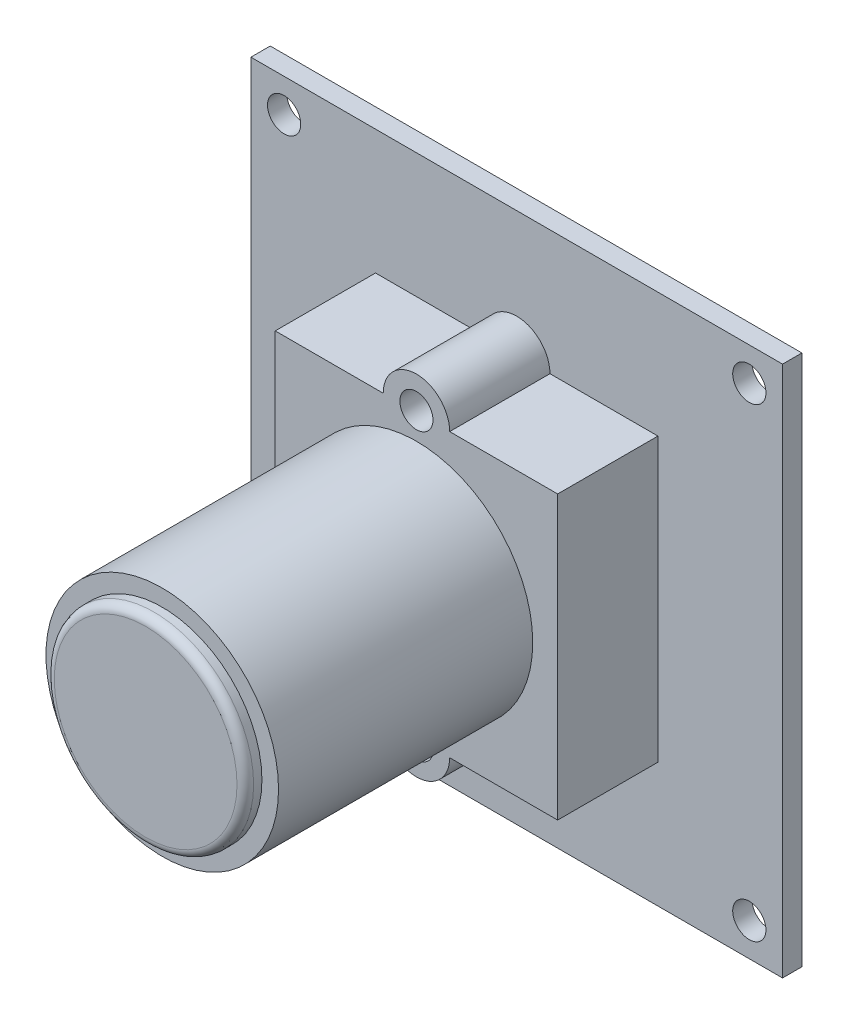
ISO-10303-21;
HEADER;
FILE_DESCRIPTION(('STEP AP214'),'2;1');
FILE_NAME('part.step','',(''),(''),'','','');
FILE_SCHEMA(('AUTOMOTIVE_DESIGN { 1 0 10303 214 1 1 1 1 }'));
ENDSEC;
DATA;
#1=APPLICATION_CONTEXT('core data for automotive mechanical design processes');
#2=APPLICATION_PROTOCOL_DEFINITION('international standard','automotive_design',2000,#1);
#3=PRODUCT_CONTEXT('',#1,'mechanical');
#4=PRODUCT('Part','Part','',(#3));
#5=PRODUCT_RELATED_PRODUCT_CATEGORY('part','',(#4));
#6=PRODUCT_DEFINITION_FORMATION('','',#4);
#7=PRODUCT_DEFINITION_CONTEXT('part definition',#1,'design');
#8=PRODUCT_DEFINITION('design','',#6,#7);
#9=PRODUCT_DEFINITION_SHAPE('','',#8);
#10=(LENGTH_UNIT() NAMED_UNIT(*) SI_UNIT(.MILLI.,.METRE.));
#11=(NAMED_UNIT(*) PLANE_ANGLE_UNIT() SI_UNIT($,.RADIAN.));
#12=(NAMED_UNIT(*) SI_UNIT($,.STERADIAN.) SOLID_ANGLE_UNIT());
#13=UNCERTAINTY_MEASURE_WITH_UNIT(LENGTH_MEASURE(1.E-05),#10,'distance_accuracy_value','');
#14=(GEOMETRIC_REPRESENTATION_CONTEXT(3) GLOBAL_UNCERTAINTY_ASSIGNED_CONTEXT((#13)) GLOBAL_UNIT_ASSIGNED_CONTEXT((#10,
#11,#12)) REPRESENTATION_CONTEXT('',''));
#15=CARTESIAN_POINT('',(0.,0.,0.));
#16=DIRECTION('',(0.,0.,1.));
#17=DIRECTION('',(1.,0.,0.));
#18=AXIS2_PLACEMENT_3D('',#15,#16,#17);
#19=CARTESIAN_POINT('',(-8.5,-8.5,24.0416305603426));
#20=DIRECTION('',(0.,1.,0.));
#21=DIRECTION('',(0.,0.,1.));
#22=AXIS2_PLACEMENT_3D('',#19,#20,#21);
#23=PLANE('',#22);
#24=DIRECTION('',(1.,0.,0.));
#25=VECTOR('',#24,1.);
#26=CARTESIAN_POINT('',(-8.5,-8.5,-6.03608460415897));
#27=LINE('',#26,#25);
#28=CARTESIAN_POINT('',(-8.5,-8.5,-6.03608460415897));
#29=VERTEX_POINT('',#28);
#30=CARTESIAN_POINT('',(-2.,-8.5,-6.03608460415897));
#31=VERTEX_POINT('',#30);
#32=EDGE_CURVE('E145',#29,#31,#27,.T.);
#33=ORIENTED_EDGE('',*,*,#32,.T.);
#34=DIRECTION('',(0.,0.,1.));
#35=VECTOR('',#34,1.);
#36=CARTESIAN_POINT('',(-2.,-8.5,-11.6929388536514));
#37=LINE('',#36,#35);
#38=CARTESIAN_POINT('',(-2.,-8.5,0.));
#39=VERTEX_POINT('',#38);
#40=EDGE_CURVE('E50',#31,#39,#37,.T.);
#41=ORIENTED_EDGE('',*,*,#40,.T.);
#42=DIRECTION('',(1.,0.,0.));
#43=VECTOR('',#42,1.);
#44=CARTESIAN_POINT('',(-8.5,-8.5,0.));
#45=LINE('',#44,#43);
#46=CARTESIAN_POINT('',(-8.5,-8.5,0.));
#47=VERTEX_POINT('',#46);
#48=EDGE_CURVE('E138',#47,#39,#45,.T.);
#49=ORIENTED_EDGE('',*,*,#48,.F.);
#50=DIRECTION('',(0.,0.,-1.));
#51=VECTOR('',#50,1.);
#52=CARTESIAN_POINT('',(-8.5,-8.5,24.0416305603426));
#53=LINE('',#52,#51);
#54=EDGE_CURVE('E164',#47,#29,#53,.T.);
#55=ORIENTED_EDGE('',*,*,#54,.T.);
#56=EDGE_LOOP('',(#33,#41,#49,#55));
#57=FACE_BOUND('',#56,.T.);
#58=ADVANCED_FACE('F35',(#57),#23,.F.);
#59=CARTESIAN_POINT('',(-8.5,8.5,24.0416305603426));
#60=DIRECTION('',(0.,-1.,0.));
#61=DIRECTION('',(0.,0.,-1.));
#62=AXIS2_PLACEMENT_3D('',#59,#60,#61);
#63=PLANE('',#62);
#64=DIRECTION('',(-1.,0.,0.));
#65=VECTOR('',#64,1.);
#66=CARTESIAN_POINT('',(-8.5,8.5,-6.03608460415897));
#67=LINE('',#66,#65);
#68=CARTESIAN_POINT('',(8.5,8.5,-6.03608460415896));
#69=VERTEX_POINT('',#68);
#70=CARTESIAN_POINT('',(2.,8.5,-6.03608460415896));
#71=VERTEX_POINT('',#70);
#72=EDGE_CURVE('E163',#69,#71,#67,.T.);
#73=ORIENTED_EDGE('',*,*,#72,.T.);
#74=DIRECTION('',(0.,0.,1.));
#75=VECTOR('',#74,1.);
#76=CARTESIAN_POINT('',(2.,8.5,-11.6929388536514));
#77=LINE('',#76,#75);
#78=CARTESIAN_POINT('',(2.,8.5,0.));
#79=VERTEX_POINT('',#78);
#80=EDGE_CURVE('E58',#71,#79,#77,.T.);
#81=ORIENTED_EDGE('',*,*,#80,.T.);
#82=DIRECTION('',(-1.,0.,0.));
#83=VECTOR('',#82,1.);
#84=CARTESIAN_POINT('',(-8.5,8.5,0.));
#85=LINE('',#84,#83);
#86=CARTESIAN_POINT('',(8.5,8.5,0.));
#87=VERTEX_POINT('',#86);
#88=EDGE_CURVE('E241',#87,#79,#85,.T.);
#89=ORIENTED_EDGE('',*,*,#88,.F.);
#90=DIRECTION('',(0.,0.,-1.));
#91=VECTOR('',#90,1.);
#92=CARTESIAN_POINT('',(8.5,8.5,24.0416305603426));
#93=LINE('',#92,#91);
#94=EDGE_CURVE('E154',#87,#69,#93,.T.);
#95=ORIENTED_EDGE('',*,*,#94,.T.);
#96=EDGE_LOOP('',(#73,#81,#89,#95));
#97=FACE_BOUND('',#96,.T.);
#98=ADVANCED_FACE('F252',(#97),#63,.F.);
#99=CARTESIAN_POINT('',(0.,0.,15.3));
#100=DIRECTION('',(0.,0.,-1.));
#101=DIRECTION('',(-1.,0.,0.));
#102=AXIS2_PLACEMENT_3D('',#99,#100,#101);
#103=CYLINDRICAL_SURFACE('',#102,7.);
#104=CARTESIAN_POINT('',(0.,0.,15.3));
#105=DIRECTION('',(0.,0.,1.));
#106=DIRECTION('',(1.,0.,0.));
#107=AXIS2_PLACEMENT_3D('',#104,#105,#106);
#108=CIRCLE('',#107,7.);
#109=CARTESIAN_POINT('',(7.,0.,15.3));
#110=VERTEX_POINT('',#109);
#111=EDGE_CURVE('E176',#110,#110,#108,.T.);
#112=ORIENTED_EDGE('',*,*,#111,.F.);
#113=EDGE_LOOP('',(#112));
#114=FACE_BOUND('',#113,.T.);
#115=CARTESIAN_POINT('',(0.,0.,0.));
#116=DIRECTION('',(0.,0.,1.));
#117=DIRECTION('',(1.,0.,0.));
#118=AXIS2_PLACEMENT_3D('',#115,#116,#117);
#119=CIRCLE('',#118,7.);
#120=CARTESIAN_POINT('',(7.,0.,0.));
#121=VERTEX_POINT('',#120);
#122=EDGE_CURVE('E169',#121,#121,#119,.T.);
#123=ORIENTED_EDGE('',*,*,#122,.T.);
#124=EDGE_LOOP('',(#123));
#125=FACE_BOUND('',#124,.T.);
#126=ADVANCED_FACE('F321',(#114,#125),#103,.T.);
#127=CARTESIAN_POINT('',(0.,0.,15.3));
#128=DIRECTION('',(0.,0.,1.));
#129=DIRECTION('',(1.,0.,0.));
#130=AXIS2_PLACEMENT_3D('',#127,#128,#129);
#131=PLANE('',#130);
#132=CARTESIAN_POINT('',(0.,0.,15.3));
#133=DIRECTION('',(0.,0.,1.));
#134=DIRECTION('',(1.,0.,0.));
#135=AXIS2_PLACEMENT_3D('',#132,#133,#134);
#136=CIRCLE('',#135,6.);
#137=CARTESIAN_POINT('',(6.,0.,15.3));
#138=VERTEX_POINT('',#137);
#139=EDGE_CURVE('E172',#138,#138,#136,.T.);
#140=ORIENTED_EDGE('',*,*,#139,.F.);
#141=EDGE_LOOP('',(#140));
#142=FACE_BOUND('',#141,.T.);
#143=ORIENTED_EDGE('',*,*,#111,.T.);
#144=EDGE_LOOP('',(#143));
#145=FACE_BOUND('',#144,.T.);
#146=ADVANCED_FACE('F323',(#142,#145),#131,.T.);
#147=CARTESIAN_POINT('',(0.,0.,16.3));
#148=DIRECTION('',(0.,0.,-1.));
#149=DIRECTION('',(-1.,0.,0.));
#150=AXIS2_PLACEMENT_3D('',#147,#148,#149);
#151=CYLINDRICAL_SURFACE('',#150,6.);
#152=CARTESIAN_POINT('',(0.,0.,15.8));
#153=DIRECTION('',(0.,0.,1.));
#154=DIRECTION('',(1.,0.,0.));
#155=AXIS2_PLACEMENT_3D('',#152,#153,#154);
#156=CIRCLE('',#155,6.);
#157=CARTESIAN_POINT('',(6.,0.,15.8));
#158=VERTEX_POINT('',#157);
#159=EDGE_CURVE('E43',#158,#158,#156,.F.);
#160=ORIENTED_EDGE('',*,*,#159,.T.);
#161=EDGE_LOOP('',(#160));
#162=FACE_BOUND('',#161,.T.);
#163=ORIENTED_EDGE('',*,*,#139,.T.);
#164=EDGE_LOOP('',(#163));
#165=FACE_BOUND('',#164,.T.);
#166=ADVANCED_FACE('F329',(#162,#165),#151,.T.);
#167=CARTESIAN_POINT('',(0.,0.,16.3));
#168=DIRECTION('',(0.,0.,1.));
#169=DIRECTION('',(1.,0.,0.));
#170=AXIS2_PLACEMENT_3D('',#167,#168,#169);
#171=PLANE('',#170);
#172=CARTESIAN_POINT('',(0.,0.,16.3));
#173=DIRECTION('',(0.,0.,1.));
#174=DIRECTION('',(1.,0.,0.));
#175=AXIS2_PLACEMENT_3D('',#172,#173,#174);
#176=CIRCLE('',#175,5.5);
#177=CARTESIAN_POINT('',(5.5,0.,16.3));
#178=VERTEX_POINT('',#177);
#179=EDGE_CURVE('E179',#178,#178,#176,.T.);
#180=ORIENTED_EDGE('',*,*,#179,.T.);
#181=EDGE_LOOP('',(#180));
#182=FACE_BOUND('',#181,.T.);
#183=ADVANCED_FACE('F350',(#182),#171,.T.);
#184=CARTESIAN_POINT('',(0.,0.,15.8));
#185=DIRECTION('',(0.,0.,1.));
#186=DIRECTION('',(1.,0.,0.));
#187=AXIS2_PLACEMENT_3D('',#184,#185,#186);
#188=TOROIDAL_SURFACE('',#187,5.5,0.5);
#189=ORIENTED_EDGE('',*,*,#159,.F.);
#190=EDGE_LOOP('',(#189));
#191=FACE_BOUND('',#190,.T.);
#192=ORIENTED_EDGE('',*,*,#179,.F.);
#193=EDGE_LOOP('',(#192));
#194=FACE_BOUND('',#193,.T.);
#195=ADVANCED_FACE('F37',(#191,#194),#188,.T.);
#196=CARTESIAN_POINT('',(8.5,-8.5,24.0416305603426));
#197=DIRECTION('',(-1.,0.,0.));
#198=DIRECTION('',(0.,0.,1.));
#199=AXIS2_PLACEMENT_3D('',#196,#197,#198);
#200=PLANE('',#199);
#201=DIRECTION('',(0.,1.,0.));
#202=VECTOR('',#201,1.);
#203=CARTESIAN_POINT('',(8.5,-8.5,0.));
#204=LINE('',#203,#202);
#205=CARTESIAN_POINT('',(8.5,-8.5,0.));
#206=VERTEX_POINT('',#205);
#207=EDGE_CURVE('E147',#206,#87,#204,.T.);
#208=ORIENTED_EDGE('',*,*,#207,.F.);
#209=DIRECTION('',(0.,0.,-1.));
#210=VECTOR('',#209,1.);
#211=CARTESIAN_POINT('',(8.5,-8.5,24.0416305603426));
#212=LINE('',#211,#210);
#213=CARTESIAN_POINT('',(8.5,-8.5,-6.03608460415897));
#214=VERTEX_POINT('',#213);
#215=EDGE_CURVE('E143',#206,#214,#212,.T.);
#216=ORIENTED_EDGE('',*,*,#215,.T.);
#217=DIRECTION('',(0.,1.,0.));
#218=VECTOR('',#217,1.);
#219=CARTESIAN_POINT('',(8.5,-8.5,-6.03608460415897));
#220=LINE('',#219,#218);
#221=EDGE_CURVE('E158',#214,#69,#220,.T.);
#222=ORIENTED_EDGE('',*,*,#221,.T.);
#223=ORIENTED_EDGE('',*,*,#94,.F.);
#224=EDGE_LOOP('',(#208,#216,#222,#223));
#225=FACE_BOUND('',#224,.T.);
#226=ADVANCED_FACE('F249',(#225),#200,.F.);
#227=CARTESIAN_POINT('',(-2.,8.5,0.));
#228=VERTEX_POINT('',#227);
#229=CARTESIAN_POINT('',(-8.5,8.5,0.));
#230=VERTEX_POINT('',#229);
#231=EDGE_CURVE('E243',#228,#230,#85,.T.);
#232=ORIENTED_EDGE('',*,*,#231,.F.);
#233=DIRECTION('',(0.,0.,1.));
#234=VECTOR('',#233,1.);
#235=CARTESIAN_POINT('',(-2.,8.5,-11.6929388536514));
#236=LINE('',#235,#234);
#237=CARTESIAN_POINT('',(-2.,8.5,-6.03608460415896));
#238=VERTEX_POINT('',#237);
#239=EDGE_CURVE('E253',#228,#238,#236,.F.);
#240=ORIENTED_EDGE('',*,*,#239,.T.);
#241=CARTESIAN_POINT('',(-8.5,8.5,-6.03608460415896));
#242=VERTEX_POINT('',#241);
#243=EDGE_CURVE('E157',#238,#242,#67,.T.);
#244=ORIENTED_EDGE('',*,*,#243,.T.);
#245=DIRECTION('',(0.,0.,-1.));
#246=VECTOR('',#245,1.);
#247=CARTESIAN_POINT('',(-8.5,8.5,24.0416305603426));
#248=LINE('',#247,#246);
#249=EDGE_CURVE('E159',#230,#242,#248,.T.);
#250=ORIENTED_EDGE('',*,*,#249,.F.);
#251=EDGE_LOOP('',(#232,#240,#244,#250));
#252=FACE_BOUND('',#251,.T.);
#253=ADVANCED_FACE('F285',(#252),#63,.F.);
#254=CARTESIAN_POINT('',(-8.5,-8.5,24.0416305603426));
#255=DIRECTION('',(1.,0.,0.));
#256=DIRECTION('',(0.,0.,-1.));
#257=AXIS2_PLACEMENT_3D('',#254,#255,#256);
#258=PLANE('',#257);
#259=DIRECTION('',(0.,-1.,0.));
#260=VECTOR('',#259,1.);
#261=CARTESIAN_POINT('',(-8.5,-8.5,0.));
#262=LINE('',#261,#260);
#263=EDGE_CURVE('E173',#230,#47,#262,.T.);
#264=ORIENTED_EDGE('',*,*,#263,.F.);
#265=ORIENTED_EDGE('',*,*,#249,.T.);
#266=DIRECTION('',(0.,-1.,0.));
#267=VECTOR('',#266,1.);
#268=CARTESIAN_POINT('',(-8.5,-8.5,-6.03608460415897));
#269=LINE('',#268,#267);
#270=EDGE_CURVE('E162',#242,#29,#269,.T.);
#271=ORIENTED_EDGE('',*,*,#270,.T.);
#272=ORIENTED_EDGE('',*,*,#54,.F.);
#273=EDGE_LOOP('',(#264,#265,#271,#272));
#274=FACE_BOUND('',#273,.T.);
#275=ADVANCED_FACE('F288',(#274),#258,.F.);
#276=CARTESIAN_POINT('',(2.,-8.5,0.));
#277=VERTEX_POINT('',#276);
#278=EDGE_CURVE('E134',#277,#206,#45,.T.);
#279=ORIENTED_EDGE('',*,*,#278,.F.);
#280=DIRECTION('',(0.,0.,1.));
#281=VECTOR('',#280,1.);
#282=CARTESIAN_POINT('',(2.,-8.5,-11.6929388536514));
#283=LINE('',#282,#281);
#284=CARTESIAN_POINT('',(2.,-8.5,-6.03608460415897));
#285=VERTEX_POINT('',#284);
#286=EDGE_CURVE('E121',#277,#285,#283,.F.);
#287=ORIENTED_EDGE('',*,*,#286,.T.);
#288=EDGE_CURVE('E149',#285,#214,#27,.T.);
#289=ORIENTED_EDGE('',*,*,#288,.T.);
#290=ORIENTED_EDGE('',*,*,#215,.F.);
#291=EDGE_LOOP('',(#279,#287,#289,#290));
#292=FACE_BOUND('',#291,.T.);
#293=ADVANCED_FACE('F141',(#292),#23,.F.);
#294=CARTESIAN_POINT('',(0.,0.,0.));
#295=DIRECTION('',(0.,0.,1.));
#296=DIRECTION('',(1.,0.,0.));
#297=AXIS2_PLACEMENT_3D('',#294,#295,#296);
#298=PLANE('',#297);
#299=CARTESIAN_POINT('',(0.,-8.59507353504141,0.));
#300=DIRECTION('',(0.,0.,1.));
#301=DIRECTION('',(1.,0.,0.));
#302=AXIS2_PLACEMENT_3D('',#299,#300,#301);
#303=CIRCLE('',#302,1.01118512176957);
#304=CARTESIAN_POINT('',(1.01118512176957,-8.59507353504141,0.));
#305=VERTEX_POINT('',#304);
#306=EDGE_CURVE('E299',#305,#305,#303,.T.);
#307=ORIENTED_EDGE('',*,*,#306,.F.);
#308=EDGE_LOOP('',(#307));
#309=FACE_BOUND('',#308,.T.);
#310=CARTESIAN_POINT('',(0.,8.59507353504135,0.));
#311=DIRECTION('',(0.,0.,1.));
#312=DIRECTION('',(1.,0.,0.));
#313=AXIS2_PLACEMENT_3D('',#310,#311,#312);
#314=CIRCLE('',#313,0.995331293604553);
#315=CARTESIAN_POINT('',(0.995331293604553,8.59507353504135,0.));
#316=VERTEX_POINT('',#315);
#317=EDGE_CURVE('E293',#316,#316,#314,.T.);
#318=ORIENTED_EDGE('',*,*,#317,.F.);
#319=EDGE_LOOP('',(#318));
#320=FACE_BOUND('',#319,.T.);
#321=ORIENTED_EDGE('',*,*,#122,.F.);
#322=EDGE_LOOP('',(#321));
#323=FACE_BOUND('',#322,.T.);
#324=ORIENTED_EDGE('',*,*,#48,.T.);
#325=CARTESIAN_POINT('',(0.,-8.5,0.));
#326=DIRECTION('',(0.,0.,1.));
#327=DIRECTION('',(1.,0.,0.));
#328=AXIS2_PLACEMENT_3D('',#325,#326,#327);
#329=CIRCLE('',#328,2.);
#330=EDGE_CURVE('E124',#39,#277,#329,.T.);
#331=ORIENTED_EDGE('',*,*,#330,.T.);
#332=ORIENTED_EDGE('',*,*,#278,.T.);
#333=ORIENTED_EDGE('',*,*,#207,.T.);
#334=ORIENTED_EDGE('',*,*,#88,.T.);
#335=CARTESIAN_POINT('',(0.,8.5,0.));
#336=DIRECTION('',(0.,0.,1.));
#337=DIRECTION('',(1.,0.,0.));
#338=AXIS2_PLACEMENT_3D('',#335,#336,#337);
#339=CIRCLE('',#338,2.);
#340=EDGE_CURVE('E258',#79,#228,#339,.T.);
#341=ORIENTED_EDGE('',*,*,#340,.T.);
#342=ORIENTED_EDGE('',*,*,#231,.T.);
#343=ORIENTED_EDGE('',*,*,#263,.T.);
#344=EDGE_LOOP('',(#324,#331,#332,#333,#334,#341,#342,#343));
#345=FACE_BOUND('',#344,.T.);
#346=ADVANCED_FACE('F132',(#309,#320,#323,#345),#298,.T.);
#347=CARTESIAN_POINT('',(16.,-16.,-6.03608460415898));
#348=DIRECTION('',(0.,0.,-1.));
#349=DIRECTION('',(0.,1.,0.));
#350=AXIS2_PLACEMENT_3D('',#347,#348,#349);
#351=PLANE('',#350);
#352=CARTESIAN_POINT('',(14.,14.0000000000004,-6.03608460415897));
#353=DIRECTION('',(0.,0.,1.));
#354=DIRECTION('',(1.,0.,0.));
#355=AXIS2_PLACEMENT_3D('',#352,#353,#354);
#356=CIRCLE('',#355,1.);
#357=CARTESIAN_POINT('',(15.,14.0000000000004,-6.03608460415897));
#358=VERTEX_POINT('',#357);
#359=EDGE_CURVE('E193',#358,#358,#356,.T.);
#360=ORIENTED_EDGE('',*,*,#359,.F.);
#361=EDGE_LOOP('',(#360));
#362=FACE_BOUND('',#361,.T.);
#363=CARTESIAN_POINT('',(14.0000000000003,-13.9999999999996,-6.03608460415897));
#364=DIRECTION('',(0.,0.,1.));
#365=DIRECTION('',(1.,0.,0.));
#366=AXIS2_PLACEMENT_3D('',#363,#364,#365);
#367=CIRCLE('',#366,1.);
#368=CARTESIAN_POINT('',(15.0000000000003,-13.9999999999996,-6.03608460415897));
#369=VERTEX_POINT('',#368);
#370=EDGE_CURVE('E256',#369,#369,#367,.T.);
#371=ORIENTED_EDGE('',*,*,#370,.F.);
#372=EDGE_LOOP('',(#371));
#373=FACE_BOUND('',#372,.T.);
#374=CARTESIAN_POINT('',(-13.9999999999997,-14.,-6.03608460415897));
#375=DIRECTION('',(0.,0.,1.));
#376=DIRECTION('',(1.,0.,0.));
#377=AXIS2_PLACEMENT_3D('',#374,#375,#376);
#378=CIRCLE('',#377,1.);
#379=CARTESIAN_POINT('',(-12.9999999999997,-14.,-6.03608460415897));
#380=VERTEX_POINT('',#379);
#381=EDGE_CURVE('E205',#380,#380,#378,.T.);
#382=ORIENTED_EDGE('',*,*,#381,.F.);
#383=EDGE_LOOP('',(#382));
#384=FACE_BOUND('',#383,.T.);
#385=CARTESIAN_POINT('',(-14.,14.,-6.03608460415897));
#386=DIRECTION('',(0.,0.,1.));
#387=DIRECTION('',(1.,0.,0.));
#388=AXIS2_PLACEMENT_3D('',#385,#386,#387);
#389=CIRCLE('',#388,1.);
#390=CARTESIAN_POINT('',(-13.,14.,-6.03608460415897));
#391=VERTEX_POINT('',#390);
#392=EDGE_CURVE('E188',#391,#391,#389,.T.);
#393=ORIENTED_EDGE('',*,*,#392,.F.);
#394=EDGE_LOOP('',(#393));
#395=FACE_BOUND('',#394,.T.);
#396=DIRECTION('',(0.,-1.,0.));
#397=VECTOR('',#396,1.);
#398=CARTESIAN_POINT('',(-16.,-16.,-6.03608460415898));
#399=LINE('',#398,#397);
#400=CARTESIAN_POINT('',(-16.,16.,-6.03608460415896));
#401=VERTEX_POINT('',#400);
#402=CARTESIAN_POINT('',(-16.,-16.,-6.03608460415898));
#403=VERTEX_POINT('',#402);
#404=EDGE_CURVE('E222',#401,#403,#399,.T.);
#405=ORIENTED_EDGE('',*,*,#404,.T.);
#406=DIRECTION('',(-1.,0.,0.));
#407=VECTOR('',#406,1.);
#408=CARTESIAN_POINT('',(16.,-16.,-6.03608460415898));
#409=LINE('',#408,#407);
#410=CARTESIAN_POINT('',(16.,-16.,-6.03608460415898));
#411=VERTEX_POINT('',#410);
#412=EDGE_CURVE('E227',#411,#403,#409,.T.);
#413=ORIENTED_EDGE('',*,*,#412,.F.);
#414=DIRECTION('',(0.,-1.,0.));
#415=VECTOR('',#414,1.);
#416=CARTESIAN_POINT('',(16.,-16.,-6.03608460415898));
#417=LINE('',#416,#415);
#418=CARTESIAN_POINT('',(16.,16.,-6.03608460415896));
#419=VERTEX_POINT('',#418);
#420=EDGE_CURVE('E213',#419,#411,#417,.T.);
#421=ORIENTED_EDGE('',*,*,#420,.F.);
#422=DIRECTION('',(-1.,0.,0.));
#423=VECTOR('',#422,1.);
#424=CARTESIAN_POINT('',(16.,16.,-6.03608460415896));
#425=LINE('',#424,#423);
#426=EDGE_CURVE('E230',#419,#401,#425,.T.);
#427=ORIENTED_EDGE('',*,*,#426,.T.);
#428=EDGE_LOOP('',(#405,#413,#421,#427));
#429=FACE_BOUND('',#428,.T.);
#430=ORIENTED_EDGE('',*,*,#288,.F.);
#431=CARTESIAN_POINT('',(0.,-8.5,-6.03608460415897));
#432=DIRECTION('',(0.,0.,-1.));
#433=DIRECTION('',(0.,1.,0.));
#434=AXIS2_PLACEMENT_3D('',#431,#432,#433);
#435=CIRCLE('',#434,2.);
#436=EDGE_CURVE('E125',#31,#285,#435,.F.);
#437=ORIENTED_EDGE('',*,*,#436,.F.);
#438=ORIENTED_EDGE('',*,*,#32,.F.);
#439=ORIENTED_EDGE('',*,*,#270,.F.);
#440=ORIENTED_EDGE('',*,*,#243,.F.);
#441=CARTESIAN_POINT('',(0.,8.5,-6.03608460415896));
#442=DIRECTION('',(0.,0.,-1.));
#443=DIRECTION('',(0.,1.,0.));
#444=AXIS2_PLACEMENT_3D('',#441,#442,#443);
#445=CIRCLE('',#444,2.);
#446=EDGE_CURVE('E11',#238,#71,#445,.T.);
#447=ORIENTED_EDGE('',*,*,#446,.T.);
#448=ORIENTED_EDGE('',*,*,#72,.F.);
#449=ORIENTED_EDGE('',*,*,#221,.F.);
#450=EDGE_LOOP('',(#430,#437,#438,#439,#440,#447,#448,#449));
#451=FACE_BOUND('',#450,.T.);
#452=ADVANCED_FACE('F269',(#362,#373,#384,#395,#429,#451),#351,.F.);
#453=CARTESIAN_POINT('',(16.,-16.,-7.2));
#454=DIRECTION('',(0.,0.,1.));
#455=DIRECTION('',(0.,-1.,0.));
#456=AXIS2_PLACEMENT_3D('',#453,#454,#455);
#457=PLANE('',#456);
#458=CARTESIAN_POINT('',(14.,14.0000000000004,-7.2));
#459=DIRECTION('',(0.,0.,1.));
#460=DIRECTION('',(0.,-1.,0.));
#461=AXIS2_PLACEMENT_3D('',#458,#459,#460);
#462=CIRCLE('',#461,1.);
#463=CARTESIAN_POINT('',(14.,13.0000000000004,-7.2));
#464=VERTEX_POINT('',#463);
#465=EDGE_CURVE('E195',#464,#464,#462,.T.);
#466=ORIENTED_EDGE('',*,*,#465,.T.);
#467=EDGE_LOOP('',(#466));
#468=FACE_BOUND('',#467,.T.);
#469=CARTESIAN_POINT('',(14.0000000000003,-13.9999999999996,-7.2));
#470=DIRECTION('',(0.,0.,1.));
#471=DIRECTION('',(0.,-1.,0.));
#472=AXIS2_PLACEMENT_3D('',#469,#470,#471);
#473=CIRCLE('',#472,1.);
#474=CARTESIAN_POINT('',(14.0000000000003,-14.9999999999996,-7.2));
#475=VERTEX_POINT('',#474);
#476=EDGE_CURVE('E192',#475,#475,#473,.T.);
#477=ORIENTED_EDGE('',*,*,#476,.T.);
#478=EDGE_LOOP('',(#477));
#479=FACE_BOUND('',#478,.T.);
#480=CARTESIAN_POINT('',(-13.9999999999997,-14.,-7.2));
#481=DIRECTION('',(0.,0.,1.));
#482=DIRECTION('',(0.,-1.,0.));
#483=AXIS2_PLACEMENT_3D('',#480,#481,#482);
#484=CIRCLE('',#483,1.);
#485=CARTESIAN_POINT('',(-13.9999999999997,-15.,-7.2));
#486=VERTEX_POINT('',#485);
#487=EDGE_CURVE('E189',#486,#486,#484,.T.);
#488=ORIENTED_EDGE('',*,*,#487,.T.);
#489=EDGE_LOOP('',(#488));
#490=FACE_BOUND('',#489,.T.);
#491=CARTESIAN_POINT('',(-14.,14.,-7.2));
#492=DIRECTION('',(0.,0.,1.));
#493=DIRECTION('',(0.,-1.,0.));
#494=AXIS2_PLACEMENT_3D('',#491,#492,#493);
#495=CIRCLE('',#494,1.);
#496=CARTESIAN_POINT('',(-14.,13.,-7.2));
#497=VERTEX_POINT('',#496);
#498=EDGE_CURVE('E184',#497,#497,#495,.T.);
#499=ORIENTED_EDGE('',*,*,#498,.T.);
#500=EDGE_LOOP('',(#499));
#501=FACE_BOUND('',#500,.T.);
#502=DIRECTION('',(0.,1.,0.));
#503=VECTOR('',#502,1.);
#504=CARTESIAN_POINT('',(-16.,-16.,-7.2));
#505=LINE('',#504,#503);
#506=CARTESIAN_POINT('',(-16.,-16.,-7.2));
#507=VERTEX_POINT('',#506);
#508=CARTESIAN_POINT('',(-16.,16.,-7.2));
#509=VERTEX_POINT('',#508);
#510=EDGE_CURVE('E187',#507,#509,#505,.T.);
#511=ORIENTED_EDGE('',*,*,#510,.T.);
#512=DIRECTION('',(-1.,0.,0.));
#513=VECTOR('',#512,1.);
#514=CARTESIAN_POINT('',(16.,16.,-7.2));
#515=LINE('',#514,#513);
#516=CARTESIAN_POINT('',(16.,16.,-7.2));
#517=VERTEX_POINT('',#516);
#518=EDGE_CURVE('E168',#517,#509,#515,.T.);
#519=ORIENTED_EDGE('',*,*,#518,.F.);
#520=DIRECTION('',(0.,1.,0.));
#521=VECTOR('',#520,1.);
#522=CARTESIAN_POINT('',(16.,-16.,-7.2));
#523=LINE('',#522,#521);
#524=CARTESIAN_POINT('',(16.,-16.,-7.2));
#525=VERTEX_POINT('',#524);
#526=EDGE_CURVE('E207',#525,#517,#523,.T.);
#527=ORIENTED_EDGE('',*,*,#526,.F.);
#528=DIRECTION('',(-1.,0.,0.));
#529=VECTOR('',#528,1.);
#530=CARTESIAN_POINT('',(16.,-16.,-7.2));
#531=LINE('',#530,#529);
#532=EDGE_CURVE('E217',#525,#507,#531,.T.);
#533=ORIENTED_EDGE('',*,*,#532,.T.);
#534=EDGE_LOOP('',(#511,#519,#527,#533));
#535=FACE_BOUND('',#534,.T.);
#536=ADVANCED_FACE('F272',(#468,#479,#490,#501,#535),#457,.F.);
#537=CARTESIAN_POINT('',(16.,16.,-7.2));
#538=DIRECTION('',(0.,-1.,0.));
#539=DIRECTION('',(0.,0.,-1.));
#540=AXIS2_PLACEMENT_3D('',#537,#538,#539);
#541=PLANE('',#540);
#542=DIRECTION('',(0.,0.,1.));
#543=VECTOR('',#542,1.);
#544=CARTESIAN_POINT('',(-16.,16.,-7.2));
#545=LINE('',#544,#543);
#546=EDGE_CURVE('E220',#509,#401,#545,.T.);
#547=ORIENTED_EDGE('',*,*,#546,.T.);
#548=ORIENTED_EDGE('',*,*,#426,.F.);
#549=DIRECTION('',(0.,0.,1.));
#550=VECTOR('',#549,1.);
#551=CARTESIAN_POINT('',(16.,16.,-7.2));
#552=LINE('',#551,#550);
#553=EDGE_CURVE('E210',#517,#419,#552,.T.);
#554=ORIENTED_EDGE('',*,*,#553,.F.);
#555=ORIENTED_EDGE('',*,*,#518,.T.);
#556=EDGE_LOOP('',(#547,#548,#554,#555));
#557=FACE_BOUND('',#556,.T.);
#558=ADVANCED_FACE('F479',(#557),#541,.F.);
#559=CARTESIAN_POINT('',(16.,-16.,-7.2));
#560=DIRECTION('',(0.,1.,0.));
#561=DIRECTION('',(0.,0.,1.));
#562=AXIS2_PLACEMENT_3D('',#559,#560,#561);
#563=PLANE('',#562);
#564=DIRECTION('',(0.,0.,-1.));
#565=VECTOR('',#564,1.);
#566=CARTESIAN_POINT('',(-16.,-16.,-7.2));
#567=LINE('',#566,#565);
#568=EDGE_CURVE('E211',#403,#507,#567,.T.);
#569=ORIENTED_EDGE('',*,*,#568,.T.);
#570=ORIENTED_EDGE('',*,*,#532,.F.);
#571=DIRECTION('',(0.,0.,-1.));
#572=VECTOR('',#571,1.);
#573=CARTESIAN_POINT('',(16.,-16.,-7.2));
#574=LINE('',#573,#572);
#575=EDGE_CURVE('E215',#411,#525,#574,.T.);
#576=ORIENTED_EDGE('',*,*,#575,.F.);
#577=ORIENTED_EDGE('',*,*,#412,.T.);
#578=EDGE_LOOP('',(#569,#570,#576,#577));
#579=FACE_BOUND('',#578,.T.);
#580=ADVANCED_FACE('F473',(#579),#563,.F.);
#581=CARTESIAN_POINT('',(16.,0.,0.));
#582=DIRECTION('',(1.,0.,0.));
#583=DIRECTION('',(0.,0.,-1.));
#584=AXIS2_PLACEMENT_3D('',#581,#582,#583);
#585=PLANE('',#584);
#586=ORIENTED_EDGE('',*,*,#526,.T.);
#587=ORIENTED_EDGE('',*,*,#553,.T.);
#588=ORIENTED_EDGE('',*,*,#420,.T.);
#589=ORIENTED_EDGE('',*,*,#575,.T.);
#590=EDGE_LOOP('',(#586,#587,#588,#589));
#591=FACE_BOUND('',#590,.T.);
#592=ADVANCED_FACE('F470',(#591),#585,.T.);
#593=CARTESIAN_POINT('',(-16.,0.,0.));
#594=DIRECTION('',(1.,0.,0.));
#595=DIRECTION('',(0.,0.,-1.));
#596=AXIS2_PLACEMENT_3D('',#593,#594,#595);
#597=PLANE('',#596);
#598=ORIENTED_EDGE('',*,*,#510,.F.);
#599=ORIENTED_EDGE('',*,*,#568,.F.);
#600=ORIENTED_EDGE('',*,*,#404,.F.);
#601=ORIENTED_EDGE('',*,*,#546,.F.);
#602=EDGE_LOOP('',(#598,#599,#600,#601));
#603=FACE_BOUND('',#602,.T.);
#604=ADVANCED_FACE('F469',(#603),#597,.F.);
#605=CARTESIAN_POINT('',(-14.,14.,-10.036084604159));
#606=DIRECTION('',(0.,0.,1.));
#607=DIRECTION('',(1.,0.,0.));
#608=AXIS2_PLACEMENT_3D('',#605,#606,#607);
#609=CYLINDRICAL_SURFACE('',#608,1.);
#610=ORIENTED_EDGE('',*,*,#392,.T.);
#611=EDGE_LOOP('',(#610));
#612=FACE_BOUND('',#611,.T.);
#613=ORIENTED_EDGE('',*,*,#498,.F.);
#614=EDGE_LOOP('',(#613));
#615=FACE_BOUND('',#614,.T.);
#616=ADVANCED_FACE('F465',(#612,#615),#609,.F.);
#617=CARTESIAN_POINT('',(-13.9999999999997,-14.,-10.036084604159));
#618=DIRECTION('',(0.,0.,1.));
#619=DIRECTION('',(1.,0.,0.));
#620=AXIS2_PLACEMENT_3D('',#617,#618,#619);
#621=CYLINDRICAL_SURFACE('',#620,1.);
#622=ORIENTED_EDGE('',*,*,#381,.T.);
#623=EDGE_LOOP('',(#622));
#624=FACE_BOUND('',#623,.T.);
#625=ORIENTED_EDGE('',*,*,#487,.F.);
#626=EDGE_LOOP('',(#625));
#627=FACE_BOUND('',#626,.T.);
#628=ADVANCED_FACE('F462',(#624,#627),#621,.F.);
#629=CARTESIAN_POINT('',(14.0000000000003,-13.9999999999996,-10.036084604159));
#630=DIRECTION('',(0.,0.,1.));
#631=DIRECTION('',(1.,0.,0.));
#632=AXIS2_PLACEMENT_3D('',#629,#630,#631);
#633=CYLINDRICAL_SURFACE('',#632,1.);
#634=ORIENTED_EDGE('',*,*,#370,.T.);
#635=EDGE_LOOP('',(#634));
#636=FACE_BOUND('',#635,.T.);
#637=ORIENTED_EDGE('',*,*,#476,.F.);
#638=EDGE_LOOP('',(#637));
#639=FACE_BOUND('',#638,.T.);
#640=ADVANCED_FACE('F266',(#636,#639),#633,.F.);
#641=CARTESIAN_POINT('',(14.,14.0000000000004,-10.036084604159));
#642=DIRECTION('',(0.,0.,1.));
#643=DIRECTION('',(1.,0.,0.));
#644=AXIS2_PLACEMENT_3D('',#641,#642,#643);
#645=CYLINDRICAL_SURFACE('',#644,1.);
#646=ORIENTED_EDGE('',*,*,#359,.T.);
#647=EDGE_LOOP('',(#646));
#648=FACE_BOUND('',#647,.T.);
#649=ORIENTED_EDGE('',*,*,#465,.F.);
#650=EDGE_LOOP('',(#649));
#651=FACE_BOUND('',#650,.T.);
#652=ADVANCED_FACE('F404',(#648,#651),#645,.F.);
#653=CARTESIAN_POINT('',(0.,8.5,-11.6929388536514));
#654=DIRECTION('',(0.,0.,1.));
#655=DIRECTION('',(1.,0.,0.));
#656=AXIS2_PLACEMENT_3D('',#653,#654,#655);
#657=CYLINDRICAL_SURFACE('',#656,2.);
#658=ORIENTED_EDGE('',*,*,#80,.F.);
#659=ORIENTED_EDGE('',*,*,#446,.F.);
#660=ORIENTED_EDGE('',*,*,#239,.F.);
#661=ORIENTED_EDGE('',*,*,#340,.F.);
#662=EDGE_LOOP('',(#658,#659,#660,#661));
#663=FACE_BOUND('',#662,.T.);
#664=ADVANCED_FACE('F283',(#663),#657,.T.);
#665=CARTESIAN_POINT('',(0.,-8.5,-11.6929388536514));
#666=DIRECTION('',(0.,0.,1.));
#667=DIRECTION('',(1.,0.,0.));
#668=AXIS2_PLACEMENT_3D('',#665,#666,#667);
#669=CYLINDRICAL_SURFACE('',#668,2.);
#670=ORIENTED_EDGE('',*,*,#40,.F.);
#671=ORIENTED_EDGE('',*,*,#436,.T.);
#672=ORIENTED_EDGE('',*,*,#286,.F.);
#673=ORIENTED_EDGE('',*,*,#330,.F.);
#674=EDGE_LOOP('',(#670,#671,#672,#673));
#675=FACE_BOUND('',#674,.T.);
#676=ADVANCED_FACE('F123',(#675),#669,.T.);
#677=CARTESIAN_POINT('',(0.,8.59507353504135,-4.));
#678=DIRECTION('',(0.,0.,1.));
#679=DIRECTION('',(1.,0.,0.));
#680=AXIS2_PLACEMENT_3D('',#677,#678,#679);
#681=CYLINDRICAL_SURFACE('',#680,0.995331293604553);
#682=CARTESIAN_POINT('',(0.,8.59507353504135,-4.));
#683=DIRECTION('',(0.,0.,1.));
#684=DIRECTION('',(1.,0.,0.));
#685=AXIS2_PLACEMENT_3D('',#682,#683,#684);
#686=CIRCLE('',#685,0.995331293604553);
#687=CARTESIAN_POINT('',(0.995331293604553,8.59507353504135,-4.));
#688=VERTEX_POINT('',#687);
#689=EDGE_CURVE('E139',#688,#688,#686,.T.);
#690=ORIENTED_EDGE('',*,*,#689,.F.);
#691=EDGE_LOOP('',(#690));
#692=FACE_BOUND('',#691,.T.);
#693=ORIENTED_EDGE('',*,*,#317,.T.);
#694=EDGE_LOOP('',(#693));
#695=FACE_BOUND('',#694,.T.);
#696=ADVANCED_FACE('F415',(#692,#695),#681,.F.);
#697=CARTESIAN_POINT('',(0.,8.59507353504135,-4.));
#698=DIRECTION('',(0.,0.,1.));
#699=DIRECTION('',(1.,0.,0.));
#700=AXIS2_PLACEMENT_3D('',#697,#698,#699);
#701=PLANE('',#700);
#702=ORIENTED_EDGE('',*,*,#689,.T.);
#703=EDGE_LOOP('',(#702));
#704=FACE_BOUND('',#703,.T.);
#705=ADVANCED_FACE('F310',(#704),#701,.T.);
#706=CARTESIAN_POINT('',(0.,-8.59507353504141,-4.));
#707=DIRECTION('',(0.,0.,1.));
#708=DIRECTION('',(1.,0.,0.));
#709=AXIS2_PLACEMENT_3D('',#706,#707,#708);
#710=CYLINDRICAL_SURFACE('',#709,1.01118512176957);
#711=CARTESIAN_POINT('',(0.,-8.59507353504141,-4.));
#712=DIRECTION('',(0.,0.,1.));
#713=DIRECTION('',(1.,0.,0.));
#714=AXIS2_PLACEMENT_3D('',#711,#712,#713);
#715=CIRCLE('',#714,1.01118512176957);
#716=CARTESIAN_POINT('',(1.01118512176957,-8.59507353504141,-4.));
#717=VERTEX_POINT('',#716);
#718=EDGE_CURVE('E296',#717,#717,#715,.T.);
#719=ORIENTED_EDGE('',*,*,#718,.F.);
#720=EDGE_LOOP('',(#719));
#721=FACE_BOUND('',#720,.T.);
#722=ORIENTED_EDGE('',*,*,#306,.T.);
#723=EDGE_LOOP('',(#722));
#724=FACE_BOUND('',#723,.T.);
#725=ADVANCED_FACE('F307',(#721,#724),#710,.F.);
#726=CARTESIAN_POINT('',(0.,-8.59507353504141,-4.));
#727=DIRECTION('',(0.,0.,1.));
#728=DIRECTION('',(1.,0.,0.));
#729=AXIS2_PLACEMENT_3D('',#726,#727,#728);
#730=PLANE('',#729);
#731=ORIENTED_EDGE('',*,*,#718,.T.);
#732=EDGE_LOOP('',(#731));
#733=FACE_BOUND('',#732,.T.);
#734=ADVANCED_FACE('F305',(#733),#730,.T.);
#735=CLOSED_SHELL('',(#58,#98,#126,#146,#166,#183,#195,#226,#253,#275,#293,#346,#452,#536,#558,
#580,#592,#604,#616,#628,#640,#652,#664,#676,#696,#705,#725,#734));
#736=MANIFOLD_SOLID_BREP('B2',#735);
#737=ADVANCED_BREP_SHAPE_REPRESENTATION('',(#18,#736),#14);
#738=SHAPE_DEFINITION_REPRESENTATION(#9,#737);
ENDSEC;
END-ISO-10303-21;
